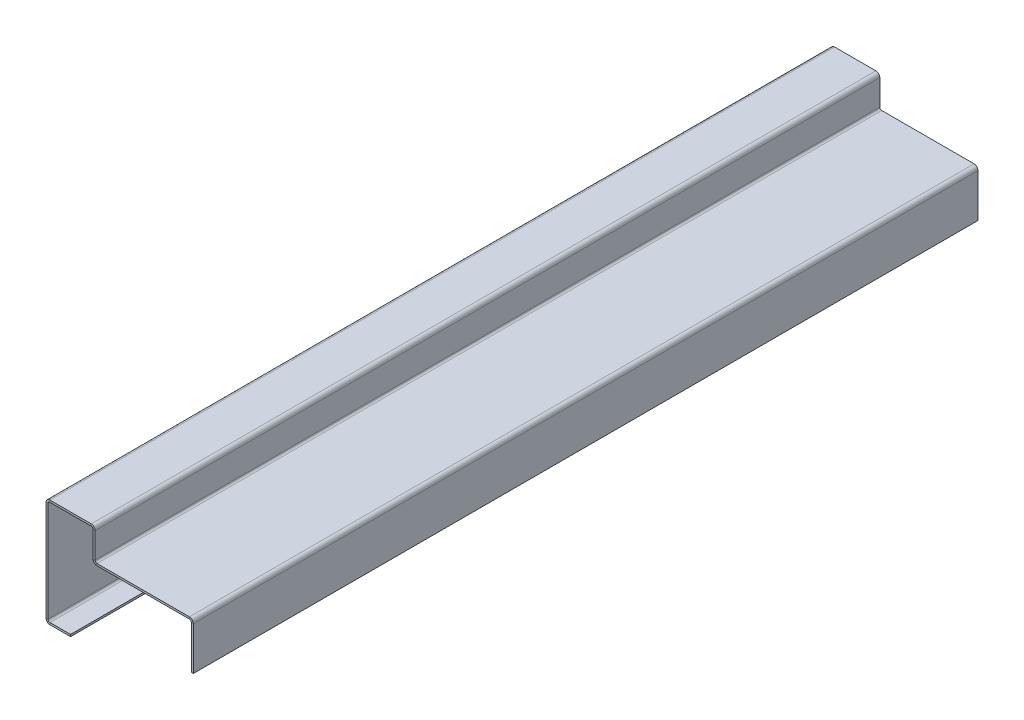
ISO-10303-21;
HEADER;
FILE_DESCRIPTION(('STEP AP214'),'2;1');
FILE_NAME('part.step','',(''),(''),'','','');
FILE_SCHEMA(('AUTOMOTIVE_DESIGN { 1 0 10303 214 1 1 1 1 }'));
ENDSEC;
DATA;
#1=APPLICATION_CONTEXT('core data for automotive mechanical design processes');
#2=APPLICATION_PROTOCOL_DEFINITION('international standard','automotive_design',2000,#1);
#3=PRODUCT_CONTEXT('',#1,'mechanical');
#4=PRODUCT('Part','Part','',(#3));
#5=PRODUCT_RELATED_PRODUCT_CATEGORY('part','',(#4));
#6=PRODUCT_DEFINITION_FORMATION('','',#4);
#7=PRODUCT_DEFINITION_CONTEXT('part definition',#1,'design');
#8=PRODUCT_DEFINITION('design','',#6,#7);
#9=PRODUCT_DEFINITION_SHAPE('','',#8);
#10=(LENGTH_UNIT() NAMED_UNIT(*) SI_UNIT(.MILLI.,.METRE.));
#11=(NAMED_UNIT(*) PLANE_ANGLE_UNIT() SI_UNIT($,.RADIAN.));
#12=(NAMED_UNIT(*) SI_UNIT($,.STERADIAN.) SOLID_ANGLE_UNIT());
#13=UNCERTAINTY_MEASURE_WITH_UNIT(LENGTH_MEASURE(1.E-05),#10,'distance_accuracy_value','');
#14=(GEOMETRIC_REPRESENTATION_CONTEXT(3) GLOBAL_UNCERTAINTY_ASSIGNED_CONTEXT((#13)) GLOBAL_UNIT_ASSIGNED_CONTEXT((#10,
#11,#12)) REPRESENTATION_CONTEXT('',''));
#15=CARTESIAN_POINT('',(0.,0.,0.));
#16=DIRECTION('',(0.,0.,1.));
#17=DIRECTION('',(1.,0.,0.));
#18=AXIS2_PLACEMENT_3D('',#15,#16,#17);
#19=CARTESIAN_POINT('',(0.,4.,799.));
#20=DIRECTION('',(0.,0.,1.));
#21=DIRECTION('',(1.,0.,0.));
#22=AXIS2_PLACEMENT_3D('',#19,#20,#21);
#23=PLANE('',#22);
#24=DIRECTION('',(1.,0.,0.));
#25=VECTOR('',#24,1.);
#26=CARTESIAN_POINT('',(0.,4.,799.));
#27=LINE('',#26,#25);
#28=CARTESIAN_POINT('',(0.,4.,799.));
#29=VERTEX_POINT('',#28);
#30=CARTESIAN_POINT('',(2.,4.,799.));
#31=VERTEX_POINT('',#30);
#32=EDGE_CURVE('E11',#29,#31,#27,.T.);
#33=ORIENTED_EDGE('',*,*,#32,.F.);
#34=CARTESIAN_POINT('',(4.,4.,799.));
#35=DIRECTION('',(0.,0.,1.));
#36=DIRECTION('',(1.,0.,0.));
#37=AXIS2_PLACEMENT_3D('',#34,#35,#36);
#38=CIRCLE('',#37,4.);
#39=CARTESIAN_POINT('',(4.,0.,799.));
#40=VERTEX_POINT('',#39);
#41=EDGE_CURVE('E423',#40,#29,#38,.F.);
#42=ORIENTED_EDGE('',*,*,#41,.F.);
#43=DIRECTION('',(0.,-1.,0.));
#44=VECTOR('',#43,1.);
#45=CARTESIAN_POINT('',(4.,2.,799.));
#46=LINE('',#45,#44);
#47=CARTESIAN_POINT('',(4.,2.,799.));
#48=VERTEX_POINT('',#47);
#49=EDGE_CURVE('E46',#48,#40,#46,.T.);
#50=ORIENTED_EDGE('',*,*,#49,.F.);
#51=CARTESIAN_POINT('',(4.,4.,799.));
#52=DIRECTION('',(0.,0.,1.));
#53=DIRECTION('',(1.,0.,0.));
#54=AXIS2_PLACEMENT_3D('',#51,#52,#53);
#55=CIRCLE('',#54,2.);
#56=EDGE_CURVE('E436',#48,#31,#55,.F.);
#57=ORIENTED_EDGE('',*,*,#56,.T.);
#58=EDGE_LOOP('',(#33,#42,#50,#57));
#59=FACE_BOUND('',#58,.T.);
#60=ADVANCED_FACE('F38',(#59),#23,.T.);
#61=CARTESIAN_POINT('',(4.,2.,799.));
#62=DIRECTION('',(0.,0.,1.));
#63=DIRECTION('',(1.,0.,0.));
#64=AXIS2_PLACEMENT_3D('',#61,#62,#63);
#65=PLANE('',#64);
#66=DIRECTION('',(0.,1.,0.));
#67=VECTOR('',#66,1.);
#68=CARTESIAN_POINT('',(0.,0.,799.));
#69=LINE('',#68,#67);
#70=CARTESIAN_POINT('',(0.,106.,799.));
#71=VERTEX_POINT('',#70);
#72=EDGE_CURVE('E427',#29,#71,#69,.T.);
#73=ORIENTED_EDGE('',*,*,#72,.F.);
#74=ORIENTED_EDGE('',*,*,#32,.T.);
#75=DIRECTION('',(0.,1.,0.));
#76=VECTOR('',#75,1.);
#77=CARTESIAN_POINT('',(2.,0.,799.));
#78=LINE('',#77,#76);
#79=CARTESIAN_POINT('',(2.,106.,799.));
#80=VERTEX_POINT('',#79);
#81=EDGE_CURVE('E438',#31,#80,#78,.T.);
#82=ORIENTED_EDGE('',*,*,#81,.T.);
#83=DIRECTION('',(-1.,0.,0.));
#84=VECTOR('',#83,1.);
#85=CARTESIAN_POINT('',(2.,106.,799.));
#86=LINE('',#85,#84);
#87=EDGE_CURVE('E397',#80,#71,#86,.T.);
#88=ORIENTED_EDGE('',*,*,#87,.T.);
#89=EDGE_LOOP('',(#73,#74,#82,#88));
#90=FACE_BOUND('',#89,.T.);
#91=ADVANCED_FACE('F519',(#90),#65,.T.);
#92=CARTESIAN_POINT('',(4.,0.,0.));
#93=DIRECTION('',(0.,0.,-1.));
#94=DIRECTION('',(-1.,0.,0.));
#95=AXIS2_PLACEMENT_3D('',#92,#93,#94);
#96=PLANE('',#95);
#97=DIRECTION('',(0.,1.,0.));
#98=VECTOR('',#97,1.);
#99=CARTESIAN_POINT('',(4.,0.,0.));
#100=LINE('',#99,#98);
#101=CARTESIAN_POINT('',(4.,0.,0.));
#102=VERTEX_POINT('',#101);
#103=CARTESIAN_POINT('',(4.,2.,0.));
#104=VERTEX_POINT('',#103);
#105=EDGE_CURVE('E403',#102,#104,#100,.T.);
#106=ORIENTED_EDGE('',*,*,#105,.F.);
#107=CARTESIAN_POINT('',(4.,4.,0.));
#108=DIRECTION('',(0.,0.,1.));
#109=DIRECTION('',(1.,0.,0.));
#110=AXIS2_PLACEMENT_3D('',#107,#108,#109);
#111=CIRCLE('',#110,4.);
#112=CARTESIAN_POINT('',(0.,4.,0.));
#113=VERTEX_POINT('',#112);
#114=EDGE_CURVE('E281',#102,#113,#111,.F.);
#115=ORIENTED_EDGE('',*,*,#114,.T.);
#116=DIRECTION('',(-1.,0.,0.));
#117=VECTOR('',#116,1.);
#118=CARTESIAN_POINT('',(2.,4.,0.));
#119=LINE('',#118,#117);
#120=CARTESIAN_POINT('',(2.,4.,0.));
#121=VERTEX_POINT('',#120);
#122=EDGE_CURVE('E401',#121,#113,#119,.T.);
#123=ORIENTED_EDGE('',*,*,#122,.F.);
#124=CARTESIAN_POINT('',(4.,4.,0.));
#125=DIRECTION('',(0.,0.,1.));
#126=DIRECTION('',(1.,0.,0.));
#127=AXIS2_PLACEMENT_3D('',#124,#125,#126);
#128=CIRCLE('',#127,2.);
#129=EDGE_CURVE('E293',#104,#121,#128,.F.);
#130=ORIENTED_EDGE('',*,*,#129,.F.);
#131=EDGE_LOOP('',(#106,#115,#123,#130));
#132=FACE_BOUND('',#131,.T.);
#133=ADVANCED_FACE('F578',(#132),#96,.T.);
#134=CARTESIAN_POINT('',(2.,4.,0.));
#135=DIRECTION('',(0.,0.,-1.));
#136=DIRECTION('',(-1.,0.,0.));
#137=AXIS2_PLACEMENT_3D('',#134,#135,#136);
#138=PLANE('',#137);
#139=DIRECTION('',(-1.,0.,0.));
#140=VECTOR('',#139,1.);
#141=CARTESIAN_POINT('',(25.,0.,0.));
#142=LINE('',#141,#140);
#143=CARTESIAN_POINT('',(25.,0.,0.));
#144=VERTEX_POINT('',#143);
#145=EDGE_CURVE('E284',#144,#102,#142,.T.);
#146=ORIENTED_EDGE('',*,*,#145,.T.);
#147=ORIENTED_EDGE('',*,*,#105,.T.);
#148=DIRECTION('',(-1.,0.,0.));
#149=VECTOR('',#148,1.);
#150=CARTESIAN_POINT('',(25.,2.,0.));
#151=LINE('',#150,#149);
#152=CARTESIAN_POINT('',(25.,2.,0.));
#153=VERTEX_POINT('',#152);
#154=EDGE_CURVE('E290',#153,#104,#151,.T.);
#155=ORIENTED_EDGE('',*,*,#154,.F.);
#156=DIRECTION('',(0.,-1.,0.));
#157=VECTOR('',#156,1.);
#158=CARTESIAN_POINT('',(25.,2.,0.));
#159=LINE('',#158,#157);
#160=EDGE_CURVE('E287',#153,#144,#159,.T.);
#161=ORIENTED_EDGE('',*,*,#160,.T.);
#162=EDGE_LOOP('',(#146,#147,#155,#161));
#163=FACE_BOUND('',#162,.T.);
#164=ADVANCED_FACE('F582',(#163),#138,.T.);
#165=CARTESIAN_POINT('',(4.,110.,799.));
#166=DIRECTION('',(0.,0.,1.));
#167=DIRECTION('',(1.,0.,0.));
#168=AXIS2_PLACEMENT_3D('',#165,#166,#167);
#169=PLANE('',#168);
#170=DIRECTION('',(0.,-1.,0.));
#171=VECTOR('',#170,1.);
#172=CARTESIAN_POINT('',(4.,110.,799.));
#173=LINE('',#172,#171);
#174=CARTESIAN_POINT('',(4.,110.,799.));
#175=VERTEX_POINT('',#174);
#176=CARTESIAN_POINT('',(4.,108.,799.));
#177=VERTEX_POINT('',#176);
#178=EDGE_CURVE('E399',#175,#177,#173,.T.);
#179=ORIENTED_EDGE('',*,*,#178,.F.);
#180=CARTESIAN_POINT('',(4.,106.,799.));
#181=DIRECTION('',(0.,0.,1.));
#182=DIRECTION('',(1.,0.,0.));
#183=AXIS2_PLACEMENT_3D('',#180,#181,#182);
#184=CIRCLE('',#183,4.);
#185=EDGE_CURVE('E509',#71,#175,#184,.F.);
#186=ORIENTED_EDGE('',*,*,#185,.F.);
#187=ORIENTED_EDGE('',*,*,#87,.F.);
#188=CARTESIAN_POINT('',(4.,106.,799.));
#189=DIRECTION('',(0.,0.,1.));
#190=DIRECTION('',(1.,0.,0.));
#191=AXIS2_PLACEMENT_3D('',#188,#189,#190);
#192=CIRCLE('',#191,2.);
#193=EDGE_CURVE('E441',#80,#177,#192,.F.);
#194=ORIENTED_EDGE('',*,*,#193,.T.);
#195=EDGE_LOOP('',(#179,#186,#187,#194));
#196=FACE_BOUND('',#195,.T.);
#197=ADVANCED_FACE('F526',(#196),#169,.T.);
#198=CARTESIAN_POINT('',(2.,106.,799.));
#199=DIRECTION('',(0.,0.,1.));
#200=DIRECTION('',(1.,0.,0.));
#201=AXIS2_PLACEMENT_3D('',#198,#199,#200);
#202=PLANE('',#201);
#203=DIRECTION('',(1.,0.,0.));
#204=VECTOR('',#203,1.);
#205=CARTESIAN_POINT('',(0.,110.,799.));
#206=LINE('',#205,#204);
#207=CARTESIAN_POINT('',(46.,110.,799.));
#208=VERTEX_POINT('',#207);
#209=EDGE_CURVE('E506',#175,#208,#206,.T.);
#210=ORIENTED_EDGE('',*,*,#209,.F.);
#211=ORIENTED_EDGE('',*,*,#178,.T.);
#212=DIRECTION('',(1.,0.,0.));
#213=VECTOR('',#212,1.);
#214=CARTESIAN_POINT('',(0.,108.,799.));
#215=LINE('',#214,#213);
#216=CARTESIAN_POINT('',(46.,108.,799.));
#217=VERTEX_POINT('',#216);
#218=EDGE_CURVE('E444',#177,#217,#215,.T.);
#219=ORIENTED_EDGE('',*,*,#218,.T.);
#220=DIRECTION('',(0.,1.,0.));
#221=VECTOR('',#220,1.);
#222=CARTESIAN_POINT('',(46.,108.,799.));
#223=LINE('',#222,#221);
#224=EDGE_CURVE('E389',#217,#208,#223,.T.);
#225=ORIENTED_EDGE('',*,*,#224,.T.);
#226=EDGE_LOOP('',(#210,#211,#219,#225));
#227=FACE_BOUND('',#226,.T.);
#228=ADVANCED_FACE('F535',(#227),#202,.T.);
#229=CARTESIAN_POINT('',(0.,106.,0.));
#230=DIRECTION('',(0.,0.,-1.));
#231=DIRECTION('',(-1.,0.,0.));
#232=AXIS2_PLACEMENT_3D('',#229,#230,#231);
#233=PLANE('',#232);
#234=DIRECTION('',(1.,0.,0.));
#235=VECTOR('',#234,1.);
#236=CARTESIAN_POINT('',(0.,106.,0.));
#237=LINE('',#236,#235);
#238=CARTESIAN_POINT('',(0.,106.,0.));
#239=VERTEX_POINT('',#238);
#240=CARTESIAN_POINT('',(2.,106.,0.));
#241=VERTEX_POINT('',#240);
#242=EDGE_CURVE('E395',#239,#241,#237,.T.);
#243=ORIENTED_EDGE('',*,*,#242,.F.);
#244=CARTESIAN_POINT('',(4.,106.,0.));
#245=DIRECTION('',(0.,0.,1.));
#246=DIRECTION('',(1.,0.,0.));
#247=AXIS2_PLACEMENT_3D('',#244,#245,#246);
#248=CIRCLE('',#247,4.);
#249=CARTESIAN_POINT('',(4.,110.,0.));
#250=VERTEX_POINT('',#249);
#251=EDGE_CURVE('E275',#239,#250,#248,.F.);
#252=ORIENTED_EDGE('',*,*,#251,.T.);
#253=DIRECTION('',(0.,1.,0.));
#254=VECTOR('',#253,1.);
#255=CARTESIAN_POINT('',(4.,108.,0.));
#256=LINE('',#255,#254);
#257=CARTESIAN_POINT('',(4.,108.,0.));
#258=VERTEX_POINT('',#257);
#259=EDGE_CURVE('E393',#258,#250,#256,.T.);
#260=ORIENTED_EDGE('',*,*,#259,.F.);
#261=CARTESIAN_POINT('',(4.,106.,0.));
#262=DIRECTION('',(0.,0.,1.));
#263=DIRECTION('',(1.,0.,0.));
#264=AXIS2_PLACEMENT_3D('',#261,#262,#263);
#265=CIRCLE('',#264,2.);
#266=EDGE_CURVE('E299',#241,#258,#265,.F.);
#267=ORIENTED_EDGE('',*,*,#266,.F.);
#268=EDGE_LOOP('',(#243,#252,#260,#267));
#269=FACE_BOUND('',#268,.T.);
#270=ADVANCED_FACE('F593',(#269),#233,.T.);
#271=CARTESIAN_POINT('',(4.,108.,0.));
#272=DIRECTION('',(0.,0.,-1.));
#273=DIRECTION('',(-1.,0.,0.));
#274=AXIS2_PLACEMENT_3D('',#271,#272,#273);
#275=PLANE('',#274);
#276=DIRECTION('',(0.,1.,0.));
#277=VECTOR('',#276,1.);
#278=CARTESIAN_POINT('',(0.,0.,0.));
#279=LINE('',#278,#277);
#280=EDGE_CURVE('E278',#113,#239,#279,.T.);
#281=ORIENTED_EDGE('',*,*,#280,.T.);
#282=ORIENTED_EDGE('',*,*,#242,.T.);
#283=DIRECTION('',(0.,1.,0.));
#284=VECTOR('',#283,1.);
#285=CARTESIAN_POINT('',(2.,0.,0.));
#286=LINE('',#285,#284);
#287=EDGE_CURVE('E296',#121,#241,#286,.T.);
#288=ORIENTED_EDGE('',*,*,#287,.F.);
#289=ORIENTED_EDGE('',*,*,#122,.T.);
#290=EDGE_LOOP('',(#281,#282,#288,#289));
#291=FACE_BOUND('',#290,.T.);
#292=ADVANCED_FACE('F596',(#291),#275,.T.);
#293=CARTESIAN_POINT('',(50.,106.,799.));
#294=DIRECTION('',(0.,0.,1.));
#295=DIRECTION('',(1.,0.,0.));
#296=AXIS2_PLACEMENT_3D('',#293,#294,#295);
#297=PLANE('',#296);
#298=DIRECTION('',(-1.,0.,0.));
#299=VECTOR('',#298,1.);
#300=CARTESIAN_POINT('',(50.,106.,799.));
#301=LINE('',#300,#299);
#302=CARTESIAN_POINT('',(50.,106.,799.));
#303=VERTEX_POINT('',#302);
#304=CARTESIAN_POINT('',(48.,106.,799.));
#305=VERTEX_POINT('',#304);
#306=EDGE_CURVE('E391',#303,#305,#301,.T.);
#307=ORIENTED_EDGE('',*,*,#306,.F.);
#308=CARTESIAN_POINT('',(46.,106.,799.));
#309=DIRECTION('',(0.,0.,1.));
#310=DIRECTION('',(1.,0.,0.));
#311=AXIS2_PLACEMENT_3D('',#308,#309,#310);
#312=CIRCLE('',#311,4.);
#313=EDGE_CURVE('E503',#208,#303,#312,.F.);
#314=ORIENTED_EDGE('',*,*,#313,.F.);
#315=ORIENTED_EDGE('',*,*,#224,.F.);
#316=CARTESIAN_POINT('',(46.,106.,799.));
#317=DIRECTION('',(0.,0.,1.));
#318=DIRECTION('',(1.,0.,0.));
#319=AXIS2_PLACEMENT_3D('',#316,#317,#318);
#320=CIRCLE('',#319,2.);
#321=EDGE_CURVE('E447',#217,#305,#320,.F.);
#322=ORIENTED_EDGE('',*,*,#321,.T.);
#323=EDGE_LOOP('',(#307,#314,#315,#322));
#324=FACE_BOUND('',#323,.T.);
#325=ADVANCED_FACE('F544',(#324),#297,.T.);
#326=CARTESIAN_POINT('',(46.,108.,799.));
#327=DIRECTION('',(0.,0.,1.));
#328=DIRECTION('',(1.,0.,0.));
#329=AXIS2_PLACEMENT_3D('',#326,#327,#328);
#330=PLANE('',#329);
#331=DIRECTION('',(0.,-1.,0.));
#332=VECTOR('',#331,1.);
#333=CARTESIAN_POINT('',(50.,110.,799.));
#334=LINE('',#333,#332);
#335=CARTESIAN_POINT('',(50.,80.,799.));
#336=VERTEX_POINT('',#335);
#337=EDGE_CURVE('E500',#303,#336,#334,.T.);
#338=ORIENTED_EDGE('',*,*,#337,.F.);
#339=ORIENTED_EDGE('',*,*,#306,.T.);
#340=DIRECTION('',(0.,1.,0.));
#341=VECTOR('',#340,1.);
#342=CARTESIAN_POINT('',(48.,110.,799.));
#343=LINE('',#342,#341);
#344=CARTESIAN_POINT('',(48.,80.,799.));
#345=VERTEX_POINT('',#344);
#346=EDGE_CURVE('E229',#305,#345,#343,.F.);
#347=ORIENTED_EDGE('',*,*,#346,.T.);
#348=DIRECTION('',(1.,0.,0.));
#349=VECTOR('',#348,1.);
#350=CARTESIAN_POINT('',(48.,80.,799.));
#351=LINE('',#350,#349);
#352=EDGE_CURVE('E220',#345,#336,#351,.T.);
#353=ORIENTED_EDGE('',*,*,#352,.T.);
#354=EDGE_LOOP('',(#338,#339,#347,#353));
#355=FACE_BOUND('',#354,.T.);
#356=ADVANCED_FACE('F453',(#355),#330,.T.);
#357=CARTESIAN_POINT('',(46.,110.,0.));
#358=DIRECTION('',(0.,0.,-1.));
#359=DIRECTION('',(-1.,0.,0.));
#360=AXIS2_PLACEMENT_3D('',#357,#358,#359);
#361=PLANE('',#360);
#362=DIRECTION('',(0.,-1.,0.));
#363=VECTOR('',#362,1.);
#364=CARTESIAN_POINT('',(46.,110.,0.));
#365=LINE('',#364,#363);
#366=CARTESIAN_POINT('',(46.,110.,0.));
#367=VERTEX_POINT('',#366);
#368=CARTESIAN_POINT('',(46.,108.,0.));
#369=VERTEX_POINT('',#368);
#370=EDGE_CURVE('E387',#367,#369,#365,.T.);
#371=ORIENTED_EDGE('',*,*,#370,.F.);
#372=CARTESIAN_POINT('',(46.,106.,0.));
#373=DIRECTION('',(0.,0.,1.));
#374=DIRECTION('',(1.,0.,0.));
#375=AXIS2_PLACEMENT_3D('',#372,#373,#374);
#376=CIRCLE('',#375,4.);
#377=CARTESIAN_POINT('',(50.,106.,0.));
#378=VERTEX_POINT('',#377);
#379=EDGE_CURVE('E269',#367,#378,#376,.F.);
#380=ORIENTED_EDGE('',*,*,#379,.T.);
#381=DIRECTION('',(1.,0.,0.));
#382=VECTOR('',#381,1.);
#383=CARTESIAN_POINT('',(48.,106.,0.));
#384=LINE('',#383,#382);
#385=CARTESIAN_POINT('',(48.,106.,0.));
#386=VERTEX_POINT('',#385);
#387=EDGE_CURVE('E219',#386,#378,#384,.T.);
#388=ORIENTED_EDGE('',*,*,#387,.F.);
#389=CARTESIAN_POINT('',(46.,106.,0.));
#390=DIRECTION('',(0.,0.,1.));
#391=DIRECTION('',(1.,0.,0.));
#392=AXIS2_PLACEMENT_3D('',#389,#390,#391);
#393=CIRCLE('',#392,2.);
#394=EDGE_CURVE('E305',#369,#386,#393,.F.);
#395=ORIENTED_EDGE('',*,*,#394,.F.);
#396=EDGE_LOOP('',(#371,#380,#388,#395));
#397=FACE_BOUND('',#396,.T.);
#398=ADVANCED_FACE('F553',(#397),#361,.T.);
#399=CARTESIAN_POINT('',(48.,106.,0.));
#400=DIRECTION('',(0.,0.,-1.));
#401=DIRECTION('',(-1.,0.,0.));
#402=AXIS2_PLACEMENT_3D('',#399,#400,#401);
#403=PLANE('',#402);
#404=DIRECTION('',(1.,0.,0.));
#405=VECTOR('',#404,1.);
#406=CARTESIAN_POINT('',(0.,110.,0.));
#407=LINE('',#406,#405);
#408=EDGE_CURVE('E272',#250,#367,#407,.T.);
#409=ORIENTED_EDGE('',*,*,#408,.T.);
#410=ORIENTED_EDGE('',*,*,#370,.T.);
#411=DIRECTION('',(1.,0.,0.));
#412=VECTOR('',#411,1.);
#413=CARTESIAN_POINT('',(0.,108.,0.));
#414=LINE('',#413,#412);
#415=EDGE_CURVE('E302',#258,#369,#414,.T.);
#416=ORIENTED_EDGE('',*,*,#415,.F.);
#417=ORIENTED_EDGE('',*,*,#259,.T.);
#418=EDGE_LOOP('',(#409,#410,#416,#417));
#419=FACE_BOUND('',#418,.T.);
#420=ADVANCED_FACE('F557',(#419),#403,.T.);
#421=CARTESIAN_POINT('',(52.,78.,799.));
#422=DIRECTION('',(0.,0.,1.));
#423=DIRECTION('',(1.,0.,0.));
#424=AXIS2_PLACEMENT_3D('',#421,#422,#423);
#425=PLANE('',#424);
#426=DIRECTION('',(0.,-1.,0.));
#427=VECTOR('',#426,1.);
#428=CARTESIAN_POINT('',(52.,78.,799.));
#429=LINE('',#428,#427);
#430=CARTESIAN_POINT('',(52.,78.,799.));
#431=VERTEX_POINT('',#430);
#432=CARTESIAN_POINT('',(52.,76.,799.));
#433=VERTEX_POINT('',#432);
#434=EDGE_CURVE('E207',#431,#433,#429,.T.);
#435=ORIENTED_EDGE('',*,*,#434,.F.);
#436=CARTESIAN_POINT('',(52.,80.,799.));
#437=DIRECTION('',(0.,0.,-1.));
#438=DIRECTION('',(-1.,0.,0.));
#439=AXIS2_PLACEMENT_3D('',#436,#437,#438);
#440=CIRCLE('',#439,2.);
#441=EDGE_CURVE('E465',#336,#431,#440,.F.);
#442=ORIENTED_EDGE('',*,*,#441,.F.);
#443=ORIENTED_EDGE('',*,*,#352,.F.);
#444=CARTESIAN_POINT('',(52.,80.,799.));
#445=DIRECTION('',(0.,0.,1.));
#446=DIRECTION('',(1.,0.,0.));
#447=AXIS2_PLACEMENT_3D('',#444,#445,#446);
#448=CIRCLE('',#447,4.);
#449=EDGE_CURVE('E223',#345,#433,#448,.T.);
#450=ORIENTED_EDGE('',*,*,#449,.T.);
#451=EDGE_LOOP('',(#435,#442,#443,#450));
#452=FACE_BOUND('',#451,.T.);
#453=ADVANCED_FACE('F225',(#452),#425,.T.);
#454=CARTESIAN_POINT('',(48.,80.,799.));
#455=DIRECTION('',(0.,0.,1.));
#456=DIRECTION('',(1.,0.,0.));
#457=AXIS2_PLACEMENT_3D('',#454,#455,#456);
#458=PLANE('',#457);
#459=DIRECTION('',(1.,0.,0.));
#460=VECTOR('',#459,1.);
#461=CARTESIAN_POINT('',(50.,78.,799.));
#462=LINE('',#461,#460);
#463=CARTESIAN_POINT('',(146.,78.,799.));
#464=VERTEX_POINT('',#463);
#465=EDGE_CURVE('E214',#431,#464,#462,.T.);
#466=ORIENTED_EDGE('',*,*,#465,.F.);
#467=ORIENTED_EDGE('',*,*,#434,.T.);
#468=DIRECTION('',(1.,0.,0.));
#469=VECTOR('',#468,1.);
#470=CARTESIAN_POINT('',(50.,76.,799.));
#471=LINE('',#470,#469);
#472=CARTESIAN_POINT('',(146.,76.,799.));
#473=VERTEX_POINT('',#472);
#474=EDGE_CURVE('E211',#433,#473,#471,.T.);
#475=ORIENTED_EDGE('',*,*,#474,.T.);
#476=DIRECTION('',(0.,1.,0.));
#477=VECTOR('',#476,1.);
#478=CARTESIAN_POINT('',(146.,76.,799.));
#479=LINE('',#478,#477);
#480=EDGE_CURVE('E378',#473,#464,#479,.T.);
#481=ORIENTED_EDGE('',*,*,#480,.T.);
#482=EDGE_LOOP('',(#466,#467,#475,#481));
#483=FACE_BOUND('',#482,.T.);
#484=ADVANCED_FACE('F209',(#483),#458,.T.);
#485=CARTESIAN_POINT('',(50.,80.,0.));
#486=DIRECTION('',(0.,0.,-1.));
#487=DIRECTION('',(-1.,0.,0.));
#488=AXIS2_PLACEMENT_3D('',#485,#486,#487);
#489=PLANE('',#488);
#490=DIRECTION('',(-1.,0.,0.));
#491=VECTOR('',#490,1.);
#492=CARTESIAN_POINT('',(50.,80.,0.));
#493=LINE('',#492,#491);
#494=CARTESIAN_POINT('',(50.,80.,0.));
#495=VERTEX_POINT('',#494);
#496=CARTESIAN_POINT('',(48.,80.,0.));
#497=VERTEX_POINT('',#496);
#498=EDGE_CURVE('E383',#495,#497,#493,.T.);
#499=ORIENTED_EDGE('',*,*,#498,.F.);
#500=CARTESIAN_POINT('',(52.,80.,0.));
#501=DIRECTION('',(0.,0.,-1.));
#502=DIRECTION('',(-1.,0.,0.));
#503=AXIS2_PLACEMENT_3D('',#500,#501,#502);
#504=CIRCLE('',#503,2.);
#505=CARTESIAN_POINT('',(52.,78.,0.));
#506=VERTEX_POINT('',#505);
#507=EDGE_CURVE('E263',#495,#506,#504,.F.);
#508=ORIENTED_EDGE('',*,*,#507,.T.);
#509=DIRECTION('',(0.,1.,0.));
#510=VECTOR('',#509,1.);
#511=CARTESIAN_POINT('',(52.,76.,0.));
#512=LINE('',#511,#510);
#513=CARTESIAN_POINT('',(52.,76.,0.));
#514=VERTEX_POINT('',#513);
#515=EDGE_CURVE('E381',#514,#506,#512,.T.);
#516=ORIENTED_EDGE('',*,*,#515,.F.);
#517=CARTESIAN_POINT('',(52.,80.,0.));
#518=DIRECTION('',(0.,0.,1.));
#519=DIRECTION('',(1.,0.,0.));
#520=AXIS2_PLACEMENT_3D('',#517,#518,#519);
#521=CIRCLE('',#520,4.);
#522=EDGE_CURVE('E236',#497,#514,#521,.T.);
#523=ORIENTED_EDGE('',*,*,#522,.F.);
#524=EDGE_LOOP('',(#499,#508,#516,#523));
#525=FACE_BOUND('',#524,.T.);
#526=ADVANCED_FACE('F459',(#525),#489,.T.);
#527=CARTESIAN_POINT('',(52.,76.,0.));
#528=DIRECTION('',(0.,0.,-1.));
#529=DIRECTION('',(-1.,0.,0.));
#530=AXIS2_PLACEMENT_3D('',#527,#528,#529);
#531=PLANE('',#530);
#532=DIRECTION('',(0.,-1.,0.));
#533=VECTOR('',#532,1.);
#534=CARTESIAN_POINT('',(50.,110.,0.));
#535=LINE('',#534,#533);
#536=EDGE_CURVE('E266',#378,#495,#535,.T.);
#537=ORIENTED_EDGE('',*,*,#536,.T.);
#538=ORIENTED_EDGE('',*,*,#498,.T.);
#539=DIRECTION('',(0.,1.,0.));
#540=VECTOR('',#539,1.);
#541=CARTESIAN_POINT('',(48.,110.,0.));
#542=LINE('',#541,#540);
#543=EDGE_CURVE('E308',#386,#497,#542,.F.);
#544=ORIENTED_EDGE('',*,*,#543,.F.);
#545=ORIENTED_EDGE('',*,*,#387,.T.);
#546=EDGE_LOOP('',(#537,#538,#544,#545));
#547=FACE_BOUND('',#546,.T.);
#548=ADVANCED_FACE('F562',(#547),#531,.T.);
#549=CARTESIAN_POINT('',(150.,74.,799.));
#550=DIRECTION('',(0.,0.,1.));
#551=DIRECTION('',(1.,0.,0.));
#552=AXIS2_PLACEMENT_3D('',#549,#550,#551);
#553=PLANE('',#552);
#554=DIRECTION('',(-1.,0.,0.));
#555=VECTOR('',#554,1.);
#556=CARTESIAN_POINT('',(150.,74.,799.));
#557=LINE('',#556,#555);
#558=CARTESIAN_POINT('',(150.,74.,799.));
#559=VERTEX_POINT('',#558);
#560=CARTESIAN_POINT('',(148.,74.,799.));
#561=VERTEX_POINT('',#560);
#562=EDGE_CURVE('E54',#559,#561,#557,.T.);
#563=ORIENTED_EDGE('',*,*,#562,.F.);
#564=CARTESIAN_POINT('',(146.,74.,799.));
#565=DIRECTION('',(0.,0.,1.));
#566=DIRECTION('',(1.,0.,0.));
#567=AXIS2_PLACEMENT_3D('',#564,#565,#566);
#568=CIRCLE('',#567,4.);
#569=EDGE_CURVE('E493',#464,#559,#568,.F.);
#570=ORIENTED_EDGE('',*,*,#569,.F.);
#571=ORIENTED_EDGE('',*,*,#480,.F.);
#572=CARTESIAN_POINT('',(146.,74.,799.));
#573=DIRECTION('',(0.,0.,1.));
#574=DIRECTION('',(1.,0.,0.));
#575=AXIS2_PLACEMENT_3D('',#572,#573,#574);
#576=CIRCLE('',#575,2.);
#577=EDGE_CURVE('E244',#473,#561,#576,.F.);
#578=ORIENTED_EDGE('',*,*,#577,.T.);
#579=EDGE_LOOP('',(#563,#570,#571,#578));
#580=FACE_BOUND('',#579,.T.);
#581=ADVANCED_FACE('F564',(#580),#553,.T.);
#582=CARTESIAN_POINT('',(146.,76.,799.));
#583=DIRECTION('',(0.,0.,1.));
#584=DIRECTION('',(1.,0.,0.));
#585=AXIS2_PLACEMENT_3D('',#582,#583,#584);
#586=PLANE('',#585);
#587=DIRECTION('',(0.,-1.,0.));
#588=VECTOR('',#587,1.);
#589=CARTESIAN_POINT('',(150.,78.,799.));
#590=LINE('',#589,#588);
#591=CARTESIAN_POINT('',(150.,30.,799.));
#592=VERTEX_POINT('',#591);
#593=EDGE_CURVE('E491',#559,#592,#590,.T.);
#594=ORIENTED_EDGE('',*,*,#593,.F.);
#595=ORIENTED_EDGE('',*,*,#562,.T.);
#596=DIRECTION('',(0.,1.,0.));
#597=VECTOR('',#596,1.);
#598=CARTESIAN_POINT('',(148.,78.,799.));
#599=LINE('',#598,#597);
#600=CARTESIAN_POINT('',(148.,30.,799.));
#601=VERTEX_POINT('',#600);
#602=EDGE_CURVE('E144',#561,#601,#599,.F.);
#603=ORIENTED_EDGE('',*,*,#602,.T.);
#604=DIRECTION('',(-1.,0.,0.));
#605=VECTOR('',#604,1.);
#606=CARTESIAN_POINT('',(150.,30.,799.));
#607=LINE('',#606,#605);
#608=EDGE_CURVE('E489',#592,#601,#607,.T.);
#609=ORIENTED_EDGE('',*,*,#608,.F.);
#610=EDGE_LOOP('',(#594,#595,#603,#609));
#611=FACE_BOUND('',#610,.T.);
#612=ADVANCED_FACE('F570',(#611),#586,.T.);
#613=CARTESIAN_POINT('',(146.,78.,0.));
#614=DIRECTION('',(0.,0.,-1.));
#615=DIRECTION('',(-1.,0.,0.));
#616=AXIS2_PLACEMENT_3D('',#613,#614,#615);
#617=PLANE('',#616);
#618=DIRECTION('',(0.,-1.,0.));
#619=VECTOR('',#618,1.);
#620=CARTESIAN_POINT('',(146.,78.,0.));
#621=LINE('',#620,#619);
#622=CARTESIAN_POINT('',(146.,78.,0.));
#623=VERTEX_POINT('',#622);
#624=CARTESIAN_POINT('',(146.,76.,0.));
#625=VERTEX_POINT('',#624);
#626=EDGE_CURVE('E131',#623,#625,#621,.T.);
#627=ORIENTED_EDGE('',*,*,#626,.F.);
#628=CARTESIAN_POINT('',(146.,74.,0.));
#629=DIRECTION('',(0.,0.,1.));
#630=DIRECTION('',(1.,0.,0.));
#631=AXIS2_PLACEMENT_3D('',#628,#629,#630);
#632=CIRCLE('',#631,4.);
#633=CARTESIAN_POINT('',(150.,74.,0.));
#634=VERTEX_POINT('',#633);
#635=EDGE_CURVE('E259',#623,#634,#632,.F.);
#636=ORIENTED_EDGE('',*,*,#635,.T.);
#637=DIRECTION('',(1.,0.,0.));
#638=VECTOR('',#637,1.);
#639=CARTESIAN_POINT('',(148.,74.,0.));
#640=LINE('',#639,#638);
#641=CARTESIAN_POINT('',(148.,74.,0.));
#642=VERTEX_POINT('',#641);
#643=EDGE_CURVE('E138',#642,#634,#640,.T.);
#644=ORIENTED_EDGE('',*,*,#643,.F.);
#645=CARTESIAN_POINT('',(146.,74.,0.));
#646=DIRECTION('',(0.,0.,1.));
#647=DIRECTION('',(1.,0.,0.));
#648=AXIS2_PLACEMENT_3D('',#645,#646,#647);
#649=CIRCLE('',#648,2.);
#650=EDGE_CURVE('E314',#625,#642,#649,.F.);
#651=ORIENTED_EDGE('',*,*,#650,.F.);
#652=EDGE_LOOP('',(#627,#636,#644,#651));
#653=FACE_BOUND('',#652,.T.);
#654=ADVANCED_FACE('F476',(#653),#617,.T.);
#655=CARTESIAN_POINT('',(148.,74.,0.));
#656=DIRECTION('',(0.,0.,-1.));
#657=DIRECTION('',(-1.,0.,0.));
#658=AXIS2_PLACEMENT_3D('',#655,#656,#657);
#659=PLANE('',#658);
#660=DIRECTION('',(1.,0.,0.));
#661=VECTOR('',#660,1.);
#662=CARTESIAN_POINT('',(50.,78.,0.));
#663=LINE('',#662,#661);
#664=EDGE_CURVE('E261',#506,#623,#663,.T.);
#665=ORIENTED_EDGE('',*,*,#664,.T.);
#666=ORIENTED_EDGE('',*,*,#626,.T.);
#667=DIRECTION('',(1.,0.,0.));
#668=VECTOR('',#667,1.);
#669=CARTESIAN_POINT('',(50.,76.,0.));
#670=LINE('',#669,#668);
#671=EDGE_CURVE('E312',#514,#625,#670,.T.);
#672=ORIENTED_EDGE('',*,*,#671,.F.);
#673=ORIENTED_EDGE('',*,*,#515,.T.);
#674=EDGE_LOOP('',(#665,#666,#672,#673));
#675=FACE_BOUND('',#674,.T.);
#676=ADVANCED_FACE('F461',(#675),#659,.T.);
#677=CARTESIAN_POINT('',(148.,78.,799.));
#678=DIRECTION('',(1.,0.,0.));
#679=DIRECTION('',(0.,0.,-1.));
#680=AXIS2_PLACEMENT_3D('',#677,#678,#679);
#681=PLANE('',#680);
#682=DIRECTION('',(0.,1.,0.));
#683=VECTOR('',#682,1.);
#684=CARTESIAN_POINT('',(148.,78.,0.));
#685=LINE('',#684,#683);
#686=CARTESIAN_POINT('',(148.,30.,0.));
#687=VERTEX_POINT('',#686);
#688=EDGE_CURVE('E250',#642,#687,#685,.F.);
#689=ORIENTED_EDGE('',*,*,#688,.T.);
#690=DIRECTION('',(0.,0.,-1.));
#691=VECTOR('',#690,1.);
#692=CARTESIAN_POINT('',(148.,30.,799.));
#693=LINE('',#692,#691);
#694=EDGE_CURVE('E374',#601,#687,#693,.T.);
#695=ORIENTED_EDGE('',*,*,#694,.F.);
#696=ORIENTED_EDGE('',*,*,#602,.F.);
#697=DIRECTION('',(0.,0.,-1.));
#698=VECTOR('',#697,1.);
#699=CARTESIAN_POINT('',(148.,74.,799.));
#700=LINE('',#699,#698);
#701=EDGE_CURVE('E246',#561,#642,#700,.T.);
#702=ORIENTED_EDGE('',*,*,#701,.T.);
#703=EDGE_LOOP('',(#689,#695,#696,#702));
#704=FACE_BOUND('',#703,.T.);
#705=ADVANCED_FACE('F482',(#704),#681,.F.);
#706=CARTESIAN_POINT('',(150.,30.,799.));
#707=DIRECTION('',(0.,-1.,0.));
#708=DIRECTION('',(0.,0.,-1.));
#709=AXIS2_PLACEMENT_3D('',#706,#707,#708);
#710=PLANE('',#709);
#711=DIRECTION('',(-1.,0.,0.));
#712=VECTOR('',#711,1.);
#713=CARTESIAN_POINT('',(150.,30.,0.));
#714=LINE('',#713,#712);
#715=CARTESIAN_POINT('',(150.,30.,0.));
#716=VERTEX_POINT('',#715);
#717=EDGE_CURVE('E253',#716,#687,#714,.T.);
#718=ORIENTED_EDGE('',*,*,#717,.F.);
#719=DIRECTION('',(0.,0.,-1.));
#720=VECTOR('',#719,1.);
#721=CARTESIAN_POINT('',(150.,30.,799.));
#722=LINE('',#721,#720);
#723=EDGE_CURVE('E372',#592,#716,#722,.T.);
#724=ORIENTED_EDGE('',*,*,#723,.F.);
#725=ORIENTED_EDGE('',*,*,#608,.T.);
#726=ORIENTED_EDGE('',*,*,#694,.T.);
#727=EDGE_LOOP('',(#718,#724,#725,#726));
#728=FACE_BOUND('',#727,.T.);
#729=ADVANCED_FACE('F487',(#728),#710,.T.);
#730=CARTESIAN_POINT('',(150.,78.,799.));
#731=DIRECTION('',(1.,0.,0.));
#732=DIRECTION('',(0.,0.,-1.));
#733=AXIS2_PLACEMENT_3D('',#730,#731,#732);
#734=PLANE('',#733);
#735=DIRECTION('',(0.,-1.,0.));
#736=VECTOR('',#735,1.);
#737=CARTESIAN_POINT('',(150.,78.,0.));
#738=LINE('',#737,#736);
#739=EDGE_CURVE('E256',#634,#716,#738,.T.);
#740=ORIENTED_EDGE('',*,*,#739,.F.);
#741=DIRECTION('',(0.,0.,-1.));
#742=VECTOR('',#741,1.);
#743=CARTESIAN_POINT('',(150.,74.,799.));
#744=LINE('',#743,#742);
#745=EDGE_CURVE('E369',#559,#634,#744,.T.);
#746=ORIENTED_EDGE('',*,*,#745,.F.);
#747=ORIENTED_EDGE('',*,*,#593,.T.);
#748=ORIENTED_EDGE('',*,*,#723,.T.);
#749=EDGE_LOOP('',(#740,#746,#747,#748));
#750=FACE_BOUND('',#749,.T.);
#751=ADVANCED_FACE('F678',(#750),#734,.T.);
#752=CARTESIAN_POINT('',(146.,74.,799.));
#753=DIRECTION('',(0.,0.,-1.));
#754=DIRECTION('',(-1.,0.,0.));
#755=AXIS2_PLACEMENT_3D('',#752,#753,#754);
#756=CYLINDRICAL_SURFACE('',#755,4.);
#757=ORIENTED_EDGE('',*,*,#635,.F.);
#758=DIRECTION('',(0.,0.,-1.));
#759=VECTOR('',#758,1.);
#760=CARTESIAN_POINT('',(146.,78.,799.));
#761=LINE('',#760,#759);
#762=EDGE_CURVE('E366',#464,#623,#761,.T.);
#763=ORIENTED_EDGE('',*,*,#762,.F.);
#764=ORIENTED_EDGE('',*,*,#569,.T.);
#765=ORIENTED_EDGE('',*,*,#745,.T.);
#766=EDGE_LOOP('',(#757,#763,#764,#765));
#767=FACE_BOUND('',#766,.T.);
#768=ADVANCED_FACE('F473',(#767),#756,.T.);
#769=CARTESIAN_POINT('',(50.,78.,799.));
#770=DIRECTION('',(0.,1.,0.));
#771=DIRECTION('',(0.,0.,1.));
#772=AXIS2_PLACEMENT_3D('',#769,#770,#771);
#773=PLANE('',#772);
#774=ORIENTED_EDGE('',*,*,#664,.F.);
#775=DIRECTION('',(0.,0.,-1.));
#776=VECTOR('',#775,1.);
#777=CARTESIAN_POINT('',(52.,78.,799.));
#778=LINE('',#777,#776);
#779=EDGE_CURVE('E363',#431,#506,#778,.T.);
#780=ORIENTED_EDGE('',*,*,#779,.F.);
#781=ORIENTED_EDGE('',*,*,#465,.T.);
#782=ORIENTED_EDGE('',*,*,#762,.T.);
#783=EDGE_LOOP('',(#774,#780,#781,#782));
#784=FACE_BOUND('',#783,.T.);
#785=ADVANCED_FACE('F467',(#784),#773,.T.);
#786=CARTESIAN_POINT('',(52.,80.,799.));
#787=DIRECTION('',(0.,0.,-1.));
#788=DIRECTION('',(-1.,0.,0.));
#789=AXIS2_PLACEMENT_3D('',#786,#787,#788);
#790=CYLINDRICAL_SURFACE('',#789,2.);
#791=ORIENTED_EDGE('',*,*,#507,.F.);
#792=DIRECTION('',(0.,0.,-1.));
#793=VECTOR('',#792,1.);
#794=CARTESIAN_POINT('',(50.,80.,799.));
#795=LINE('',#794,#793);
#796=EDGE_CURVE('E360',#336,#495,#795,.T.);
#797=ORIENTED_EDGE('',*,*,#796,.F.);
#798=ORIENTED_EDGE('',*,*,#441,.T.);
#799=ORIENTED_EDGE('',*,*,#779,.T.);
#800=EDGE_LOOP('',(#791,#797,#798,#799));
#801=FACE_BOUND('',#800,.T.);
#802=ADVANCED_FACE('F464',(#801),#790,.F.);
#803=CARTESIAN_POINT('',(50.,110.,799.));
#804=DIRECTION('',(1.,0.,0.));
#805=DIRECTION('',(0.,0.,-1.));
#806=AXIS2_PLACEMENT_3D('',#803,#804,#805);
#807=PLANE('',#806);
#808=ORIENTED_EDGE('',*,*,#536,.F.);
#809=DIRECTION('',(0.,0.,-1.));
#810=VECTOR('',#809,1.);
#811=CARTESIAN_POINT('',(50.,106.,799.));
#812=LINE('',#811,#810);
#813=EDGE_CURVE('E357',#303,#378,#812,.T.);
#814=ORIENTED_EDGE('',*,*,#813,.F.);
#815=ORIENTED_EDGE('',*,*,#337,.T.);
#816=ORIENTED_EDGE('',*,*,#796,.T.);
#817=EDGE_LOOP('',(#808,#814,#815,#816));
#818=FACE_BOUND('',#817,.T.);
#819=ADVANCED_FACE('F550',(#818),#807,.T.);
#820=CARTESIAN_POINT('',(46.,106.,799.));
#821=DIRECTION('',(0.,0.,-1.));
#822=DIRECTION('',(-1.,0.,0.));
#823=AXIS2_PLACEMENT_3D('',#820,#821,#822);
#824=CYLINDRICAL_SURFACE('',#823,4.);
#825=ORIENTED_EDGE('',*,*,#379,.F.);
#826=DIRECTION('',(0.,0.,-1.));
#827=VECTOR('',#826,1.);
#828=CARTESIAN_POINT('',(46.,110.,799.));
#829=LINE('',#828,#827);
#830=EDGE_CURVE('E354',#208,#367,#829,.T.);
#831=ORIENTED_EDGE('',*,*,#830,.F.);
#832=ORIENTED_EDGE('',*,*,#313,.T.);
#833=ORIENTED_EDGE('',*,*,#813,.T.);
#834=EDGE_LOOP('',(#825,#831,#832,#833));
#835=FACE_BOUND('',#834,.T.);
#836=ADVANCED_FACE('F543',(#835),#824,.T.);
#837=CARTESIAN_POINT('',(0.,110.,799.));
#838=DIRECTION('',(0.,1.,0.));
#839=DIRECTION('',(0.,0.,1.));
#840=AXIS2_PLACEMENT_3D('',#837,#838,#839);
#841=PLANE('',#840);
#842=ORIENTED_EDGE('',*,*,#408,.F.);
#843=DIRECTION('',(0.,0.,-1.));
#844=VECTOR('',#843,1.);
#845=CARTESIAN_POINT('',(4.,110.,799.));
#846=LINE('',#845,#844);
#847=EDGE_CURVE('E351',#175,#250,#846,.T.);
#848=ORIENTED_EDGE('',*,*,#847,.F.);
#849=ORIENTED_EDGE('',*,*,#209,.T.);
#850=ORIENTED_EDGE('',*,*,#830,.T.);
#851=EDGE_LOOP('',(#842,#848,#849,#850));
#852=FACE_BOUND('',#851,.T.);
#853=ADVANCED_FACE('F534',(#852),#841,.T.);
#854=CARTESIAN_POINT('',(4.,106.,799.));
#855=DIRECTION('',(0.,0.,-1.));
#856=DIRECTION('',(-1.,0.,0.));
#857=AXIS2_PLACEMENT_3D('',#854,#855,#856);
#858=CYLINDRICAL_SURFACE('',#857,4.);
#859=ORIENTED_EDGE('',*,*,#251,.F.);
#860=DIRECTION('',(0.,0.,-1.));
#861=VECTOR('',#860,1.);
#862=CARTESIAN_POINT('',(0.,106.,799.));
#863=LINE('',#862,#861);
#864=EDGE_CURVE('E348',#71,#239,#863,.T.);
#865=ORIENTED_EDGE('',*,*,#864,.F.);
#866=ORIENTED_EDGE('',*,*,#185,.T.);
#867=ORIENTED_EDGE('',*,*,#847,.T.);
#868=EDGE_LOOP('',(#859,#865,#866,#867));
#869=FACE_BOUND('',#868,.T.);
#870=ADVANCED_FACE('F525',(#869),#858,.T.);
#871=CARTESIAN_POINT('',(0.,0.,799.));
#872=DIRECTION('',(-1.,0.,0.));
#873=DIRECTION('',(0.,0.,1.));
#874=AXIS2_PLACEMENT_3D('',#871,#872,#873);
#875=PLANE('',#874);
#876=ORIENTED_EDGE('',*,*,#280,.F.);
#877=DIRECTION('',(0.,0.,-1.));
#878=VECTOR('',#877,1.);
#879=CARTESIAN_POINT('',(0.,4.,799.));
#880=LINE('',#879,#878);
#881=EDGE_CURVE('E345',#29,#113,#880,.T.);
#882=ORIENTED_EDGE('',*,*,#881,.F.);
#883=ORIENTED_EDGE('',*,*,#72,.T.);
#884=ORIENTED_EDGE('',*,*,#864,.T.);
#885=EDGE_LOOP('',(#876,#882,#883,#884));
#886=FACE_BOUND('',#885,.T.);
#887=ADVANCED_FACE('F515',(#886),#875,.T.);
#888=CARTESIAN_POINT('',(4.,4.,799.));
#889=DIRECTION('',(0.,0.,-1.));
#890=DIRECTION('',(-1.,0.,0.));
#891=AXIS2_PLACEMENT_3D('',#888,#889,#890);
#892=CYLINDRICAL_SURFACE('',#891,4.);
#893=ORIENTED_EDGE('',*,*,#114,.F.);
#894=DIRECTION('',(0.,0.,-1.));
#895=VECTOR('',#894,1.);
#896=CARTESIAN_POINT('',(4.,0.,799.));
#897=LINE('',#896,#895);
#898=EDGE_CURVE('E342',#40,#102,#897,.T.);
#899=ORIENTED_EDGE('',*,*,#898,.F.);
#900=ORIENTED_EDGE('',*,*,#41,.T.);
#901=ORIENTED_EDGE('',*,*,#881,.T.);
#902=EDGE_LOOP('',(#893,#899,#900,#901));
#903=FACE_BOUND('',#902,.T.);
#904=ADVANCED_FACE('F422',(#903),#892,.T.);
#905=CARTESIAN_POINT('',(25.,0.,799.));
#906=DIRECTION('',(0.,-1.,0.));
#907=DIRECTION('',(1.,0.,0.));
#908=AXIS2_PLACEMENT_3D('',#905,#906,#907);
#909=PLANE('',#908);
#910=ORIENTED_EDGE('',*,*,#145,.F.);
#911=DIRECTION('',(0.,0.,-1.));
#912=VECTOR('',#911,1.);
#913=CARTESIAN_POINT('',(25.,0.,799.));
#914=LINE('',#913,#912);
#915=CARTESIAN_POINT('',(25.,0.,799.));
#916=VERTEX_POINT('',#915);
#917=EDGE_CURVE('E340',#916,#144,#914,.T.);
#918=ORIENTED_EDGE('',*,*,#917,.F.);
#919=DIRECTION('',(-1.,0.,0.));
#920=VECTOR('',#919,1.);
#921=CARTESIAN_POINT('',(25.,0.,799.));
#922=LINE('',#921,#920);
#923=EDGE_CURVE('E411',#916,#40,#922,.T.);
#924=ORIENTED_EDGE('',*,*,#923,.T.);
#925=ORIENTED_EDGE('',*,*,#898,.T.);
#926=EDGE_LOOP('',(#910,#918,#924,#925));
#927=FACE_BOUND('',#926,.T.);
#928=ADVANCED_FACE('F429',(#927),#909,.T.);
#929=CARTESIAN_POINT('',(25.,2.,799.));
#930=DIRECTION('',(1.,0.,0.));
#931=DIRECTION('',(0.,0.,-1.));
#932=AXIS2_PLACEMENT_3D('',#929,#930,#931);
#933=PLANE('',#932);
#934=ORIENTED_EDGE('',*,*,#160,.F.);
#935=DIRECTION('',(0.,0.,-1.));
#936=VECTOR('',#935,1.);
#937=CARTESIAN_POINT('',(25.,2.,799.));
#938=LINE('',#937,#936);
#939=CARTESIAN_POINT('',(25.,2.,799.));
#940=VERTEX_POINT('',#939);
#941=EDGE_CURVE('E338',#940,#153,#938,.T.);
#942=ORIENTED_EDGE('',*,*,#941,.F.);
#943=DIRECTION('',(0.,-1.,0.));
#944=VECTOR('',#943,1.);
#945=CARTESIAN_POINT('',(25.,2.,799.));
#946=LINE('',#945,#944);
#947=EDGE_CURVE('E430',#940,#916,#946,.T.);
#948=ORIENTED_EDGE('',*,*,#947,.T.);
#949=ORIENTED_EDGE('',*,*,#917,.T.);
#950=EDGE_LOOP('',(#934,#942,#948,#949));
#951=FACE_BOUND('',#950,.T.);
#952=ADVANCED_FACE('F779',(#951),#933,.T.);
#953=CARTESIAN_POINT('',(25.,2.,799.));
#954=DIRECTION('',(0.,-1.,0.));
#955=DIRECTION('',(1.,0.,0.));
#956=AXIS2_PLACEMENT_3D('',#953,#954,#955);
#957=PLANE('',#956);
#958=ORIENTED_EDGE('',*,*,#154,.T.);
#959=DIRECTION('',(0.,0.,-1.));
#960=VECTOR('',#959,1.);
#961=CARTESIAN_POINT('',(4.,2.,799.));
#962=LINE('',#961,#960);
#963=EDGE_CURVE('E335',#48,#104,#962,.T.);
#964=ORIENTED_EDGE('',*,*,#963,.F.);
#965=DIRECTION('',(-1.,0.,0.));
#966=VECTOR('',#965,1.);
#967=CARTESIAN_POINT('',(25.,2.,799.));
#968=LINE('',#967,#966);
#969=EDGE_CURVE('E414',#940,#48,#968,.T.);
#970=ORIENTED_EDGE('',*,*,#969,.F.);
#971=ORIENTED_EDGE('',*,*,#941,.T.);
#972=EDGE_LOOP('',(#958,#964,#970,#971));
#973=FACE_BOUND('',#972,.T.);
#974=ADVANCED_FACE('F789',(#973),#957,.F.);
#975=CARTESIAN_POINT('',(4.,4.,799.));
#976=DIRECTION('',(0.,0.,-1.));
#977=DIRECTION('',(-1.,0.,0.));
#978=AXIS2_PLACEMENT_3D('',#975,#976,#977);
#979=CYLINDRICAL_SURFACE('',#978,2.);
#980=ORIENTED_EDGE('',*,*,#129,.T.);
#981=DIRECTION('',(0.,0.,-1.));
#982=VECTOR('',#981,1.);
#983=CARTESIAN_POINT('',(2.,4.,799.));
#984=LINE('',#983,#982);
#985=EDGE_CURVE('E332',#31,#121,#984,.T.);
#986=ORIENTED_EDGE('',*,*,#985,.F.);
#987=ORIENTED_EDGE('',*,*,#56,.F.);
#988=ORIENTED_EDGE('',*,*,#963,.T.);
#989=EDGE_LOOP('',(#980,#986,#987,#988));
#990=FACE_BOUND('',#989,.T.);
#991=ADVANCED_FACE('F800',(#990),#979,.F.);
#992=CARTESIAN_POINT('',(2.,0.,799.));
#993=DIRECTION('',(-1.,0.,0.));
#994=DIRECTION('',(0.,0.,1.));
#995=AXIS2_PLACEMENT_3D('',#992,#993,#994);
#996=PLANE('',#995);
#997=ORIENTED_EDGE('',*,*,#287,.T.);
#998=DIRECTION('',(0.,0.,-1.));
#999=VECTOR('',#998,1.);
#1000=CARTESIAN_POINT('',(2.,106.,799.));
#1001=LINE('',#1000,#999);
#1002=EDGE_CURVE('E329',#80,#241,#1001,.T.);
#1003=ORIENTED_EDGE('',*,*,#1002,.F.);
#1004=ORIENTED_EDGE('',*,*,#81,.F.);
#1005=ORIENTED_EDGE('',*,*,#985,.T.);
#1006=EDGE_LOOP('',(#997,#1003,#1004,#1005));
#1007=FACE_BOUND('',#1006,.T.);
#1008=ADVANCED_FACE('F811',(#1007),#996,.F.);
#1009=CARTESIAN_POINT('',(4.,106.,799.));
#1010=DIRECTION('',(0.,0.,-1.));
#1011=DIRECTION('',(-1.,0.,0.));
#1012=AXIS2_PLACEMENT_3D('',#1009,#1010,#1011);
#1013=CYLINDRICAL_SURFACE('',#1012,2.);
#1014=ORIENTED_EDGE('',*,*,#266,.T.);
#1015=DIRECTION('',(0.,0.,-1.));
#1016=VECTOR('',#1015,1.);
#1017=CARTESIAN_POINT('',(4.,108.,799.));
#1018=LINE('',#1017,#1016);
#1019=EDGE_CURVE('E326',#177,#258,#1018,.T.);
#1020=ORIENTED_EDGE('',*,*,#1019,.F.);
#1021=ORIENTED_EDGE('',*,*,#193,.F.);
#1022=ORIENTED_EDGE('',*,*,#1002,.T.);
#1023=EDGE_LOOP('',(#1014,#1020,#1021,#1022));
#1024=FACE_BOUND('',#1023,.T.);
#1025=ADVANCED_FACE('F822',(#1024),#1013,.F.);
#1026=CARTESIAN_POINT('',(0.,108.,799.));
#1027=DIRECTION('',(0.,1.,0.));
#1028=DIRECTION('',(0.,0.,1.));
#1029=AXIS2_PLACEMENT_3D('',#1026,#1027,#1028);
#1030=PLANE('',#1029);
#1031=ORIENTED_EDGE('',*,*,#415,.T.);
#1032=DIRECTION('',(0.,0.,-1.));
#1033=VECTOR('',#1032,1.);
#1034=CARTESIAN_POINT('',(46.,108.,799.));
#1035=LINE('',#1034,#1033);
#1036=EDGE_CURVE('E323',#217,#369,#1035,.T.);
#1037=ORIENTED_EDGE('',*,*,#1036,.F.);
#1038=ORIENTED_EDGE('',*,*,#218,.F.);
#1039=ORIENTED_EDGE('',*,*,#1019,.T.);
#1040=EDGE_LOOP('',(#1031,#1037,#1038,#1039));
#1041=FACE_BOUND('',#1040,.T.);
#1042=ADVANCED_FACE('F559',(#1041),#1030,.F.);
#1043=CARTESIAN_POINT('',(46.,106.,799.));
#1044=DIRECTION('',(0.,0.,-1.));
#1045=DIRECTION('',(-1.,0.,0.));
#1046=AXIS2_PLACEMENT_3D('',#1043,#1044,#1045);
#1047=CYLINDRICAL_SURFACE('',#1046,2.);
#1048=ORIENTED_EDGE('',*,*,#394,.T.);
#1049=DIRECTION('',(0.,0.,-1.));
#1050=VECTOR('',#1049,1.);
#1051=CARTESIAN_POINT('',(48.,106.,799.));
#1052=LINE('',#1051,#1050);
#1053=EDGE_CURVE('E320',#305,#386,#1052,.T.);
#1054=ORIENTED_EDGE('',*,*,#1053,.F.);
#1055=ORIENTED_EDGE('',*,*,#321,.F.);
#1056=ORIENTED_EDGE('',*,*,#1036,.T.);
#1057=EDGE_LOOP('',(#1048,#1054,#1055,#1056));
#1058=FACE_BOUND('',#1057,.T.);
#1059=ADVANCED_FACE('F561',(#1058),#1047,.F.);
#1060=CARTESIAN_POINT('',(48.,110.,799.));
#1061=DIRECTION('',(1.,0.,0.));
#1062=DIRECTION('',(0.,0.,-1.));
#1063=AXIS2_PLACEMENT_3D('',#1060,#1061,#1062);
#1064=PLANE('',#1063);
#1065=ORIENTED_EDGE('',*,*,#543,.T.);
#1066=DIRECTION('',(0.,0.,-1.));
#1067=VECTOR('',#1066,1.);
#1068=CARTESIAN_POINT('',(48.,80.,799.));
#1069=LINE('',#1068,#1067);
#1070=EDGE_CURVE('E238',#345,#497,#1069,.T.);
#1071=ORIENTED_EDGE('',*,*,#1070,.F.);
#1072=ORIENTED_EDGE('',*,*,#346,.F.);
#1073=ORIENTED_EDGE('',*,*,#1053,.T.);
#1074=EDGE_LOOP('',(#1065,#1071,#1072,#1073));
#1075=FACE_BOUND('',#1074,.T.);
#1076=ADVANCED_FACE('F456',(#1075),#1064,.F.);
#1077=CARTESIAN_POINT('',(52.,80.,799.));
#1078=DIRECTION('',(0.,0.,-1.));
#1079=DIRECTION('',(-1.,0.,0.));
#1080=AXIS2_PLACEMENT_3D('',#1077,#1078,#1079);
#1081=CYLINDRICAL_SURFACE('',#1080,4.);
#1082=ORIENTED_EDGE('',*,*,#522,.T.);
#1083=DIRECTION('',(0.,0.,-1.));
#1084=VECTOR('',#1083,1.);
#1085=CARTESIAN_POINT('',(52.,76.,799.));
#1086=LINE('',#1085,#1084);
#1087=EDGE_CURVE('E233',#433,#514,#1086,.T.);
#1088=ORIENTED_EDGE('',*,*,#1087,.F.);
#1089=ORIENTED_EDGE('',*,*,#449,.F.);
#1090=ORIENTED_EDGE('',*,*,#1070,.T.);
#1091=EDGE_LOOP('',(#1082,#1088,#1089,#1090));
#1092=FACE_BOUND('',#1091,.T.);
#1093=ADVANCED_FACE('F234',(#1092),#1081,.T.);
#1094=CARTESIAN_POINT('',(50.,76.,799.));
#1095=DIRECTION('',(0.,1.,0.));
#1096=DIRECTION('',(0.,0.,1.));
#1097=AXIS2_PLACEMENT_3D('',#1094,#1095,#1096);
#1098=PLANE('',#1097);
#1099=ORIENTED_EDGE('',*,*,#671,.T.);
#1100=DIRECTION('',(0.,0.,-1.));
#1101=VECTOR('',#1100,1.);
#1102=CARTESIAN_POINT('',(146.,76.,799.));
#1103=LINE('',#1102,#1101);
#1104=EDGE_CURVE('E239',#473,#625,#1103,.T.);
#1105=ORIENTED_EDGE('',*,*,#1104,.F.);
#1106=ORIENTED_EDGE('',*,*,#474,.F.);
#1107=ORIENTED_EDGE('',*,*,#1087,.T.);
#1108=EDGE_LOOP('',(#1099,#1105,#1106,#1107));
#1109=FACE_BOUND('',#1108,.T.);
#1110=ADVANCED_FACE('F241',(#1109),#1098,.F.);
#1111=CARTESIAN_POINT('',(146.,74.,799.));
#1112=DIRECTION('',(0.,0.,-1.));
#1113=DIRECTION('',(-1.,0.,0.));
#1114=AXIS2_PLACEMENT_3D('',#1111,#1112,#1113);
#1115=CYLINDRICAL_SURFACE('',#1114,2.);
#1116=ORIENTED_EDGE('',*,*,#650,.T.);
#1117=ORIENTED_EDGE('',*,*,#701,.F.);
#1118=ORIENTED_EDGE('',*,*,#577,.F.);
#1119=ORIENTED_EDGE('',*,*,#1104,.T.);
#1120=EDGE_LOOP('',(#1116,#1117,#1118,#1119));
#1121=FACE_BOUND('',#1120,.T.);
#1122=ADVANCED_FACE('F479',(#1121),#1115,.F.);
#1123=CARTESIAN_POINT('',(146.,74.,799.));
#1124=DIRECTION('',(0.,0.,1.));
#1125=DIRECTION('',(1.,0.,0.));
#1126=AXIS2_PLACEMENT_3D('',#1123,#1124,#1125);
#1127=PLANE('',#1126);
#1128=ORIENTED_EDGE('',*,*,#969,.T.);
#1129=ORIENTED_EDGE('',*,*,#49,.T.);
#1130=ORIENTED_EDGE('',*,*,#923,.F.);
#1131=ORIENTED_EDGE('',*,*,#947,.F.);
#1132=EDGE_LOOP('',(#1128,#1129,#1130,#1131));
#1133=FACE_BOUND('',#1132,.T.);
#1134=ADVANCED_FACE('F408',(#1133),#1127,.T.);
#1135=CARTESIAN_POINT('',(146.,74.,0.));
#1136=DIRECTION('',(0.,0.,1.));
#1137=DIRECTION('',(1.,0.,0.));
#1138=AXIS2_PLACEMENT_3D('',#1135,#1136,#1137);
#1139=PLANE('',#1138);
#1140=ORIENTED_EDGE('',*,*,#688,.F.);
#1141=ORIENTED_EDGE('',*,*,#643,.T.);
#1142=ORIENTED_EDGE('',*,*,#739,.T.);
#1143=ORIENTED_EDGE('',*,*,#717,.T.);
#1144=EDGE_LOOP('',(#1140,#1141,#1142,#1143));
#1145=FACE_BOUND('',#1144,.T.);
#1146=ADVANCED_FACE('F484',(#1145),#1139,.F.);
#1147=CLOSED_SHELL('',(#60,#91,#133,#164,#197,#228,#270,#292,#325,#356,#398,#420,#453,#484,#526,
#548,#581,#612,#654,#676,#705,#729,#751,#768,#785,#802,#819,#836,#853,#870,#887,#904,#928,#952,
#974,#991,#1008,#1025,#1042,#1059,#1076,#1093,#1110,#1122,#1134,#1146));
#1148=MANIFOLD_SOLID_BREP('B2',#1147);
#1149=ADVANCED_BREP_SHAPE_REPRESENTATION('',(#18,#1148),#14);
#1150=SHAPE_DEFINITION_REPRESENTATION(#9,#1149);
ENDSEC;
END-ISO-10303-21;
